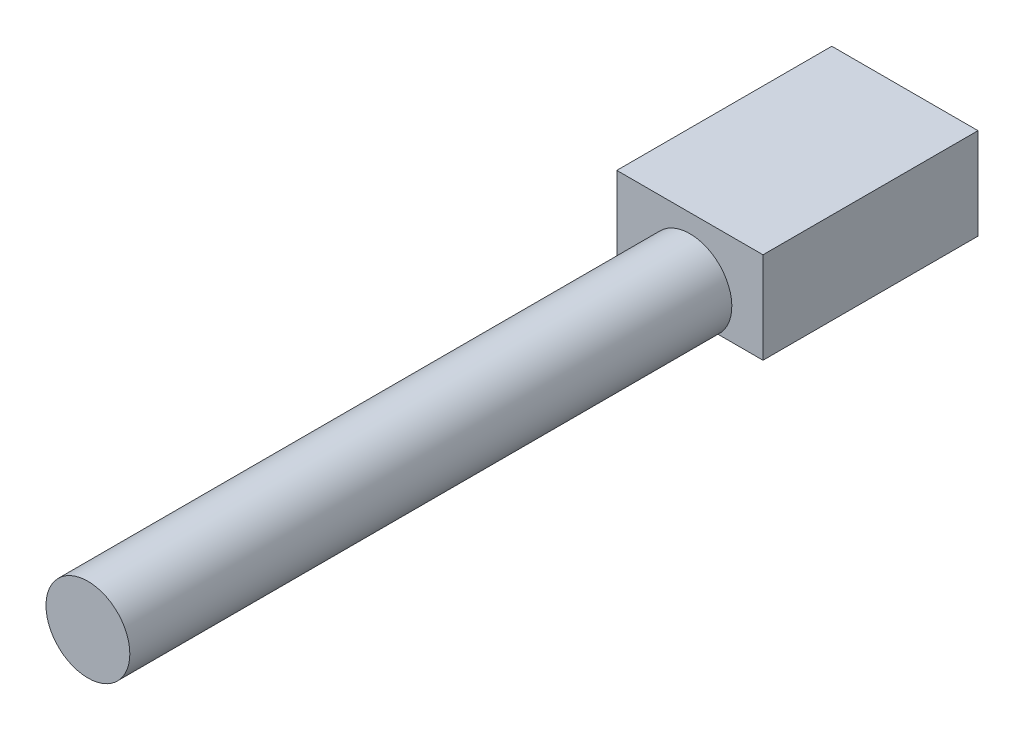
ISO-10303-21;
HEADER;
FILE_DESCRIPTION(('STEP AP214'),'2;1');
FILE_NAME('part.step','',(''),(''),'','','');
FILE_SCHEMA(('AUTOMOTIVE_DESIGN { 1 0 10303 214 1 1 1 1 }'));
ENDSEC;
DATA;
#1=APPLICATION_CONTEXT('core data for automotive mechanical design processes');
#2=APPLICATION_PROTOCOL_DEFINITION('international standard','automotive_design',2000,#1);
#3=PRODUCT_CONTEXT('',#1,'mechanical');
#4=PRODUCT('Part','Part','',(#3));
#5=PRODUCT_RELATED_PRODUCT_CATEGORY('part','',(#4));
#6=PRODUCT_DEFINITION_FORMATION('','',#4);
#7=PRODUCT_DEFINITION_CONTEXT('part definition',#1,'design');
#8=PRODUCT_DEFINITION('design','',#6,#7);
#9=PRODUCT_DEFINITION_SHAPE('','',#8);
#10=(LENGTH_UNIT() NAMED_UNIT(*) SI_UNIT(.MILLI.,.METRE.));
#11=(NAMED_UNIT(*) PLANE_ANGLE_UNIT() SI_UNIT($,.RADIAN.));
#12=(NAMED_UNIT(*) SI_UNIT($,.STERADIAN.) SOLID_ANGLE_UNIT());
#13=UNCERTAINTY_MEASURE_WITH_UNIT(LENGTH_MEASURE(1.E-05),#10,'distance_accuracy_value','');
#14=(GEOMETRIC_REPRESENTATION_CONTEXT(3) GLOBAL_UNCERTAINTY_ASSIGNED_CONTEXT((#13)) GLOBAL_UNIT_ASSIGNED_CONTEXT((#10,
#11,#12)) REPRESENTATION_CONTEXT('',''));
#15=CARTESIAN_POINT('',(0.,0.,0.));
#16=DIRECTION('',(0.,0.,1.));
#17=DIRECTION('',(1.,0.,0.));
#18=AXIS2_PLACEMENT_3D('',#15,#16,#17);
#19=CARTESIAN_POINT('',(-17.,14.,-50.));
#20=DIRECTION('',(-1.,0.,0.));
#21=DIRECTION('',(0.,0.,1.));
#22=AXIS2_PLACEMENT_3D('',#19,#20,#21);
#23=PLANE('',#22);
#24=DIRECTION('',(0.,-1.,0.));
#25=VECTOR('',#24,1.);
#26=CARTESIAN_POINT('',(-17.,14.,-50.));
#27=LINE('',#26,#25);
#28=CARTESIAN_POINT('',(-17.,14.,-50.));
#29=VERTEX_POINT('',#28);
#30=CARTESIAN_POINT('',(-17.,-7.25,-50.));
#31=VERTEX_POINT('',#30);
#32=EDGE_CURVE('E92',#29,#31,#27,.T.);
#33=ORIENTED_EDGE('',*,*,#32,.T.);
#34=DIRECTION('',(0.,0.,1.));
#35=VECTOR('',#34,1.);
#36=CARTESIAN_POINT('',(-17.,-7.25,-50.001));
#37=LINE('',#36,#35);
#38=CARTESIAN_POINT('',(-17.,-7.25,0.));
#39=VERTEX_POINT('',#38);
#40=EDGE_CURVE('E83',#31,#39,#37,.T.);
#41=ORIENTED_EDGE('',*,*,#40,.T.);
#42=DIRECTION('',(0.,-1.,0.));
#43=VECTOR('',#42,1.);
#44=CARTESIAN_POINT('',(-17.,14.,0.));
#45=LINE('',#44,#43);
#46=CARTESIAN_POINT('',(-17.,14.,0.));
#47=VERTEX_POINT('',#46);
#48=EDGE_CURVE('E80',#47,#39,#45,.T.);
#49=ORIENTED_EDGE('',*,*,#48,.F.);
#50=DIRECTION('',(0.,0.,1.));
#51=VECTOR('',#50,1.);
#52=CARTESIAN_POINT('',(-17.,14.,-50.));
#53=LINE('',#52,#51);
#54=EDGE_CURVE('E57',#29,#47,#53,.T.);
#55=ORIENTED_EDGE('',*,*,#54,.F.);
#56=EDGE_LOOP('',(#33,#41,#49,#55));
#57=FACE_BOUND('',#56,.T.);
#58=ADVANCED_FACE('F33',(#57),#23,.T.);
#59=CARTESIAN_POINT('',(17.,14.,-50.));
#60=DIRECTION('',(1.,0.,0.));
#61=DIRECTION('',(0.,0.,-1.));
#62=AXIS2_PLACEMENT_3D('',#59,#60,#61);
#63=PLANE('',#62);
#64=DIRECTION('',(0.,1.,0.));
#65=VECTOR('',#64,1.);
#66=CARTESIAN_POINT('',(17.,14.,0.));
#67=LINE('',#66,#65);
#68=CARTESIAN_POINT('',(17.,-7.25,0.));
#69=VERTEX_POINT('',#68);
#70=CARTESIAN_POINT('',(17.,14.,0.));
#71=VERTEX_POINT('',#70);
#72=EDGE_CURVE('E86',#69,#71,#67,.T.);
#73=ORIENTED_EDGE('',*,*,#72,.F.);
#74=DIRECTION('',(0.,0.,1.));
#75=VECTOR('',#74,1.);
#76=CARTESIAN_POINT('',(17.,-7.25,-50.001));
#77=LINE('',#76,#75);
#78=CARTESIAN_POINT('',(17.,-7.25,-50.));
#79=VERTEX_POINT('',#78);
#80=EDGE_CURVE('E131',#79,#69,#77,.T.);
#81=ORIENTED_EDGE('',*,*,#80,.F.);
#82=DIRECTION('',(0.,1.,0.));
#83=VECTOR('',#82,1.);
#84=CARTESIAN_POINT('',(17.,14.,-50.));
#85=LINE('',#84,#83);
#86=CARTESIAN_POINT('',(17.,14.,-50.));
#87=VERTEX_POINT('',#86);
#88=EDGE_CURVE('E94',#79,#87,#85,.T.);
#89=ORIENTED_EDGE('',*,*,#88,.T.);
#90=DIRECTION('',(0.,0.,1.));
#91=VECTOR('',#90,1.);
#92=CARTESIAN_POINT('',(17.,14.,-50.));
#93=LINE('',#92,#91);
#94=EDGE_CURVE('E76',#87,#71,#93,.T.);
#95=ORIENTED_EDGE('',*,*,#94,.T.);
#96=EDGE_LOOP('',(#73,#81,#89,#95));
#97=FACE_BOUND('',#96,.T.);
#98=ADVANCED_FACE('F141',(#97),#63,.T.);
#99=CARTESIAN_POINT('',(0.,0.,0.));
#100=DIRECTION('',(0.,0.,-1.));
#101=DIRECTION('',(-1.,0.,0.));
#102=AXIS2_PLACEMENT_3D('',#99,#100,#101);
#103=PLANE('',#102);
#104=DIRECTION('',(1.,0.,0.));
#105=VECTOR('',#104,1.);
#106=CARTESIAN_POINT('',(0.,-7.25,0.));
#107=LINE('',#106,#105);
#108=CARTESIAN_POINT('',(6.51920240520265,-7.25,0.));
#109=VERTEX_POINT('',#108);
#110=EDGE_CURVE('E48',#109,#69,#107,.T.);
#111=ORIENTED_EDGE('',*,*,#110,.T.);
#112=ORIENTED_EDGE('',*,*,#72,.T.);
#113=DIRECTION('',(-1.,0.,0.));
#114=VECTOR('',#113,1.);
#115=CARTESIAN_POINT('',(17.,14.,0.));
#116=LINE('',#115,#114);
#117=EDGE_CURVE('E73',#71,#47,#116,.T.);
#118=ORIENTED_EDGE('',*,*,#117,.T.);
#119=ORIENTED_EDGE('',*,*,#48,.T.);
#120=DIRECTION('',(1.,0.,0.));
#121=VECTOR('',#120,1.);
#122=CARTESIAN_POINT('',(0.,-7.25,0.));
#123=LINE('',#122,#121);
#124=CARTESIAN_POINT('',(-6.51920240520265,-7.25,0.));
#125=VERTEX_POINT('',#124);
#126=EDGE_CURVE('E103',#39,#125,#123,.T.);
#127=ORIENTED_EDGE('',*,*,#126,.T.);
#128=CARTESIAN_POINT('',(0.,0.,0.));
#129=DIRECTION('',(0.,0.,-1.));
#130=DIRECTION('',(-1.,0.,0.));
#131=AXIS2_PLACEMENT_3D('',#128,#129,#130);
#132=CIRCLE('',#131,9.75);
#133=EDGE_CURVE('E41',#125,#109,#132,.T.);
#134=ORIENTED_EDGE('',*,*,#133,.T.);
#135=EDGE_LOOP('',(#111,#112,#118,#119,#127,#134));
#136=FACE_BOUND('',#135,.T.);
#137=ADVANCED_FACE('F89',(#136),#103,.F.);
#138=CARTESIAN_POINT('',(0.,0.,140.));
#139=DIRECTION('',(0.,0.,-1.));
#140=DIRECTION('',(-1.,0.,0.));
#141=AXIS2_PLACEMENT_3D('',#138,#139,#140);
#142=CYLINDRICAL_SURFACE('',#141,9.75);
#143=CARTESIAN_POINT('',(0.,0.,140.));
#144=DIRECTION('',(0.,0.,1.));
#145=DIRECTION('',(1.,0.,0.));
#146=AXIS2_PLACEMENT_3D('',#143,#144,#145);
#147=CIRCLE('',#146,9.75);
#148=CARTESIAN_POINT('',(9.75,0.,140.));
#149=VERTEX_POINT('',#148);
#150=EDGE_CURVE('E11',#149,#149,#147,.T.);
#151=ORIENTED_EDGE('',*,*,#150,.F.);
#152=EDGE_LOOP('',(#151));
#153=FACE_BOUND('',#152,.T.);
#154=ORIENTED_EDGE('',*,*,#133,.F.);
#155=DIRECTION('',(0.,0.,1.));
#156=VECTOR('',#155,1.);
#157=CARTESIAN_POINT('',(-6.51920240520265,-7.25,-50.001));
#158=LINE('',#157,#156);
#159=CARTESIAN_POINT('',(-6.51920240520265,-7.25,-50.));
#160=VERTEX_POINT('',#159);
#161=EDGE_CURVE('E108',#160,#125,#158,.T.);
#162=ORIENTED_EDGE('',*,*,#161,.F.);
#163=CARTESIAN_POINT('',(0.,0.,-50.));
#164=DIRECTION('',(0.,0.,-1.));
#165=DIRECTION('',(-1.,0.,0.));
#166=AXIS2_PLACEMENT_3D('',#163,#164,#165);
#167=CIRCLE('',#166,9.75);
#168=CARTESIAN_POINT('',(6.51920240520265,-7.25,-50.));
#169=VERTEX_POINT('',#168);
#170=EDGE_CURVE('E87',#169,#160,#167,.T.);
#171=ORIENTED_EDGE('',*,*,#170,.F.);
#172=DIRECTION('',(0.,0.,1.));
#173=VECTOR('',#172,1.);
#174=CARTESIAN_POINT('',(6.51920240520265,-7.25,-50.001));
#175=LINE('',#174,#173);
#176=EDGE_CURVE('E110',#169,#109,#175,.T.);
#177=ORIENTED_EDGE('',*,*,#176,.T.);
#178=EDGE_LOOP('',(#154,#162,#171,#177));
#179=FACE_BOUND('',#178,.T.);
#180=ADVANCED_FACE('F35',(#153,#179),#142,.T.);
#181=CARTESIAN_POINT('',(0.,0.,140.));
#182=DIRECTION('',(0.,0.,1.));
#183=DIRECTION('',(1.,0.,0.));
#184=AXIS2_PLACEMENT_3D('',#181,#182,#183);
#185=PLANE('',#184);
#186=ORIENTED_EDGE('',*,*,#150,.T.);
#187=EDGE_LOOP('',(#186));
#188=FACE_BOUND('',#187,.T.);
#189=ADVANCED_FACE('F162',(#188),#185,.T.);
#190=CARTESIAN_POINT('',(17.,14.,-50.));
#191=DIRECTION('',(0.,1.,0.));
#192=DIRECTION('',(-1.,0.,0.));
#193=AXIS2_PLACEMENT_3D('',#190,#191,#192);
#194=PLANE('',#193);
#195=ORIENTED_EDGE('',*,*,#117,.F.);
#196=ORIENTED_EDGE('',*,*,#94,.F.);
#197=DIRECTION('',(-1.,0.,0.));
#198=VECTOR('',#197,1.);
#199=CARTESIAN_POINT('',(17.,14.,-50.));
#200=LINE('',#199,#198);
#201=EDGE_CURVE('E75',#87,#29,#200,.T.);
#202=ORIENTED_EDGE('',*,*,#201,.T.);
#203=ORIENTED_EDGE('',*,*,#54,.T.);
#204=EDGE_LOOP('',(#195,#196,#202,#203));
#205=FACE_BOUND('',#204,.T.);
#206=ADVANCED_FACE('F70',(#205),#194,.T.);
#207=CARTESIAN_POINT('',(0.,0.,-50.));
#208=DIRECTION('',(0.,0.,-1.));
#209=DIRECTION('',(-1.,0.,0.));
#210=AXIS2_PLACEMENT_3D('',#207,#208,#209);
#211=PLANE('',#210);
#212=ORIENTED_EDGE('',*,*,#88,.F.);
#213=DIRECTION('',(1.,0.,0.));
#214=VECTOR('',#213,1.);
#215=CARTESIAN_POINT('',(0.,-7.25,-50.));
#216=LINE('',#215,#214);
#217=EDGE_CURVE('E124',#169,#79,#216,.T.);
#218=ORIENTED_EDGE('',*,*,#217,.F.);
#219=ORIENTED_EDGE('',*,*,#170,.T.);
#220=DIRECTION('',(1.,0.,0.));
#221=VECTOR('',#220,1.);
#222=CARTESIAN_POINT('',(0.,-7.25,-50.));
#223=LINE('',#222,#221);
#224=EDGE_CURVE('E121',#31,#160,#223,.T.);
#225=ORIENTED_EDGE('',*,*,#224,.F.);
#226=ORIENTED_EDGE('',*,*,#32,.F.);
#227=ORIENTED_EDGE('',*,*,#201,.F.);
#228=EDGE_LOOP('',(#212,#218,#219,#225,#226,#227));
#229=FACE_BOUND('',#228,.T.);
#230=ADVANCED_FACE('F144',(#229),#211,.T.);
#231=CARTESIAN_POINT('',(0.,-7.25,-50.001));
#232=DIRECTION('',(0.,-1.,0.));
#233=DIRECTION('',(0.,0.,-1.));
#234=AXIS2_PLACEMENT_3D('',#231,#232,#233);
#235=PLANE('',#234);
#236=ORIENTED_EDGE('',*,*,#217,.T.);
#237=ORIENTED_EDGE('',*,*,#80,.T.);
#238=ORIENTED_EDGE('',*,*,#110,.F.);
#239=ORIENTED_EDGE('',*,*,#176,.F.);
#240=EDGE_LOOP('',(#236,#237,#238,#239));
#241=FACE_BOUND('',#240,.T.);
#242=ADVANCED_FACE('F146',(#241),#235,.T.);
#243=CARTESIAN_POINT('',(0.,-7.25,-50.001));
#244=DIRECTION('',(0.,-1.,0.));
#245=DIRECTION('',(0.,0.,-1.));
#246=AXIS2_PLACEMENT_3D('',#243,#244,#245);
#247=PLANE('',#246);
#248=ORIENTED_EDGE('',*,*,#224,.T.);
#249=ORIENTED_EDGE('',*,*,#161,.T.);
#250=ORIENTED_EDGE('',*,*,#126,.F.);
#251=ORIENTED_EDGE('',*,*,#40,.F.);
#252=EDGE_LOOP('',(#248,#249,#250,#251));
#253=FACE_BOUND('',#252,.T.);
#254=ADVANCED_FACE('F122',(#253),#247,.T.);
#255=CLOSED_SHELL('',(#58,#98,#137,#180,#189,#206,#230,#242,#254));
#256=MANIFOLD_SOLID_BREP('B2',#255);
#257=ADVANCED_BREP_SHAPE_REPRESENTATION('',(#18,#256),#14);
#258=SHAPE_DEFINITION_REPRESENTATION(#9,#257);
ENDSEC;
END-ISO-10303-21;
